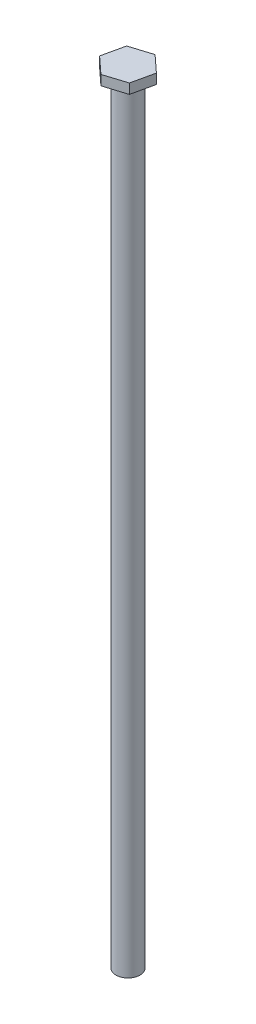
ISO-10303-21;
HEADER;
FILE_DESCRIPTION(('STEP AP214'),'2;1');
FILE_NAME('part.step','',(''),(''),'','','');
FILE_SCHEMA(('AUTOMOTIVE_DESIGN { 1 0 10303 214 1 1 1 1 }'));
ENDSEC;
DATA;
#1=APPLICATION_CONTEXT('core data for automotive mechanical design processes');
#2=APPLICATION_PROTOCOL_DEFINITION('international standard','automotive_design',2000,#1);
#3=PRODUCT_CONTEXT('',#1,'mechanical');
#4=PRODUCT('Part','Part','',(#3));
#5=PRODUCT_RELATED_PRODUCT_CATEGORY('part','',(#4));
#6=PRODUCT_DEFINITION_FORMATION('','',#4);
#7=PRODUCT_DEFINITION_CONTEXT('part definition',#1,'design');
#8=PRODUCT_DEFINITION('design','',#6,#7);
#9=PRODUCT_DEFINITION_SHAPE('','',#8);
#10=(LENGTH_UNIT() NAMED_UNIT(*) SI_UNIT(.MILLI.,.METRE.));
#11=(NAMED_UNIT(*) PLANE_ANGLE_UNIT() SI_UNIT($,.RADIAN.));
#12=(NAMED_UNIT(*) SI_UNIT($,.STERADIAN.) SOLID_ANGLE_UNIT());
#13=UNCERTAINTY_MEASURE_WITH_UNIT(LENGTH_MEASURE(1.E-05),#10,'distance_accuracy_value','');
#14=(GEOMETRIC_REPRESENTATION_CONTEXT(3) GLOBAL_UNCERTAINTY_ASSIGNED_CONTEXT((#13)) GLOBAL_UNIT_ASSIGNED_CONTEXT((#10,
#11,#12)) REPRESENTATION_CONTEXT('',''));
#15=CARTESIAN_POINT('',(0.,0.,0.));
#16=DIRECTION('',(0.,0.,1.));
#17=DIRECTION('',(1.,0.,0.));
#18=AXIS2_PLACEMENT_3D('',#15,#16,#17);
#19=CARTESIAN_POINT('',(0.,-50.,0.));
#20=DIRECTION('',(0.,1.,0.));
#21=DIRECTION('',(0.,0.,1.));
#22=AXIS2_PLACEMENT_3D('',#19,#20,#21);
#23=CYLINDRICAL_SURFACE('',#22,0.611392815707531);
#24=CARTESIAN_POINT('',(0.,-35.,0.));
#25=DIRECTION('',(0.,1.,0.));
#26=DIRECTION('',(0.,0.,1.));
#27=AXIS2_PLACEMENT_3D('',#24,#25,#26);
#28=CIRCLE('',#27,0.611392815707531);
#29=CARTESIAN_POINT('',(0.,-35.,0.611392815707531));
#30=VERTEX_POINT('',#29);
#31=EDGE_CURVE('E36',#30,#30,#28,.F.);
#32=ORIENTED_EDGE('',*,*,#31,.F.);
#33=EDGE_LOOP('',(#32));
#34=FACE_BOUND('',#33,.T.);
#35=CARTESIAN_POINT('',(0.,4.,0.));
#36=DIRECTION('',(0.,1.,0.));
#37=DIRECTION('',(0.,0.,1.));
#38=AXIS2_PLACEMENT_3D('',#35,#36,#37);
#39=CIRCLE('',#38,0.611392815707531);
#40=CARTESIAN_POINT('',(0.,4.,0.611392815707531));
#41=VERTEX_POINT('',#40);
#42=EDGE_CURVE('E11',#41,#41,#39,.T.);
#43=ORIENTED_EDGE('',*,*,#42,.F.);
#44=EDGE_LOOP('',(#43));
#45=FACE_BOUND('',#44,.T.);
#46=ADVANCED_FACE('F33',(#34,#45),#23,.T.);
#47=CARTESIAN_POINT('',(-0.249205436767229,4.5,1.11667333101922));
#48=DIRECTION('',(-0.299366858330706,0.,-0.954138084416089));
#49=DIRECTION('',(-0.954138084416089,0.,0.299366858330706));
#50=AXIS2_PLACEMENT_3D('',#47,#48,#49);
#51=PLANE('',#50);
#52=DIRECTION('',(0.954138084416089,0.,-0.299366858330706));
#53=VECTOR('',#52,1.);
#54=CARTESIAN_POINT('',(-0.249205436767229,4.,1.11667333101922));
#55=LINE('',#54,#53);
#56=CARTESIAN_POINT('',(-0.249205436767229,4.,1.11667333101922));
#57=VERTEX_POINT('',#56);
#58=CARTESIAN_POINT('',(0.842464754007616,4.,0.774154904511225));
#59=VERTEX_POINT('',#58);
#60=EDGE_CURVE('E119',#57,#59,#55,.T.);
#61=ORIENTED_EDGE('',*,*,#60,.T.);
#62=DIRECTION('',(0.,-1.,0.));
#63=VECTOR('',#62,1.);
#64=CARTESIAN_POINT('',(0.842464754007616,4.5,0.774154904511225));
#65=LINE('',#64,#63);
#66=CARTESIAN_POINT('',(0.842464754007616,4.5,0.774154904511225));
#67=VERTEX_POINT('',#66);
#68=EDGE_CURVE('E42',#67,#59,#65,.T.);
#69=ORIENTED_EDGE('',*,*,#68,.F.);
#70=DIRECTION('',(0.954138084416089,0.,-0.299366858330706));
#71=VECTOR('',#70,1.);
#72=CARTESIAN_POINT('',(-0.249205436767229,4.5,1.11667333101922));
#73=LINE('',#72,#71);
#74=CARTESIAN_POINT('',(-0.249205436767229,4.5,1.11667333101922));
#75=VERTEX_POINT('',#74);
#76=EDGE_CURVE('E129',#75,#67,#73,.T.);
#77=ORIENTED_EDGE('',*,*,#76,.F.);
#78=DIRECTION('',(0.,-1.,0.));
#79=VECTOR('',#78,1.);
#80=CARTESIAN_POINT('',(-0.249205436767229,4.5,1.11667333101922));
#81=LINE('',#80,#79);
#82=EDGE_CURVE('E115',#75,#57,#81,.T.);
#83=ORIENTED_EDGE('',*,*,#82,.T.);
#84=EDGE_LOOP('',(#61,#69,#77,#83));
#85=FACE_BOUND('',#84,.T.);
#86=ADVANCED_FACE('F141',(#85),#51,.F.);
#87=CARTESIAN_POINT('',(0.842464754007616,4.5,0.774154904511225));
#88=DIRECTION('',(-0.975991248987907,0.,-0.217809737842516));
#89=DIRECTION('',(-0.217809737842516,0.,0.975991248987907));
#90=AXIS2_PLACEMENT_3D('',#87,#88,#89);
#91=PLANE('',#90);
#92=DIRECTION('',(0.217809737842516,0.,-0.975991248987907));
#93=VECTOR('',#92,1.);
#94=CARTESIAN_POINT('',(0.842464754007616,4.,0.774154904511225));
#95=LINE('',#94,#93);
#96=CARTESIAN_POINT('',(1.09167019077484,4.,-0.342518426507991));
#97=VERTEX_POINT('',#96);
#98=EDGE_CURVE('E122',#59,#97,#95,.T.);
#99=ORIENTED_EDGE('',*,*,#98,.T.);
#100=DIRECTION('',(0.,-1.,0.));
#101=VECTOR('',#100,1.);
#102=CARTESIAN_POINT('',(1.09167019077484,4.5,-0.342518426507991));
#103=LINE('',#102,#101);
#104=CARTESIAN_POINT('',(1.09167019077484,4.5,-0.342518426507991));
#105=VERTEX_POINT('',#104);
#106=EDGE_CURVE('E133',#105,#97,#103,.T.);
#107=ORIENTED_EDGE('',*,*,#106,.F.);
#108=DIRECTION('',(0.217809737842516,0.,-0.975991248987907));
#109=VECTOR('',#108,1.);
#110=CARTESIAN_POINT('',(0.842464754007616,4.5,0.774154904511225));
#111=LINE('',#110,#109);
#112=EDGE_CURVE('E88',#67,#105,#111,.T.);
#113=ORIENTED_EDGE('',*,*,#112,.F.);
#114=ORIENTED_EDGE('',*,*,#68,.T.);
#115=EDGE_LOOP('',(#99,#107,#113,#114));
#116=FACE_BOUND('',#115,.T.);
#117=ADVANCED_FACE('F137',(#116),#91,.F.);
#118=CARTESIAN_POINT('',(1.09167019077484,4.5,-0.342518426507991));
#119=DIRECTION('',(-0.676624390657201,0.,0.736328346573573));
#120=DIRECTION('',(0.736328346573573,0.,0.676624390657201));
#121=AXIS2_PLACEMENT_3D('',#118,#119,#120);
#122=PLANE('',#121);
#123=DIRECTION('',(-0.736328346573573,0.,-0.676624390657201));
#124=VECTOR('',#123,1.);
#125=CARTESIAN_POINT('',(1.09167019077484,4.,-0.342518426507991));
#126=LINE('',#125,#124);
#127=CARTESIAN_POINT('',(0.249205436767229,4.,-1.11667333101922));
#128=VERTEX_POINT('',#127);
#129=EDGE_CURVE('E124',#97,#128,#126,.T.);
#130=ORIENTED_EDGE('',*,*,#129,.T.);
#131=DIRECTION('',(0.,-1.,0.));
#132=VECTOR('',#131,1.);
#133=CARTESIAN_POINT('',(0.249205436767229,4.5,-1.11667333101922));
#134=LINE('',#133,#132);
#135=CARTESIAN_POINT('',(0.249205436767229,4.5,-1.11667333101922));
#136=VERTEX_POINT('',#135);
#137=EDGE_CURVE('E110',#136,#128,#134,.T.);
#138=ORIENTED_EDGE('',*,*,#137,.F.);
#139=DIRECTION('',(-0.736328346573573,0.,-0.676624390657201));
#140=VECTOR('',#139,1.);
#141=CARTESIAN_POINT('',(1.09167019077484,4.5,-0.342518426507991));
#142=LINE('',#141,#140);
#143=EDGE_CURVE('E101',#105,#136,#142,.T.);
#144=ORIENTED_EDGE('',*,*,#143,.F.);
#145=ORIENTED_EDGE('',*,*,#106,.T.);
#146=EDGE_LOOP('',(#130,#138,#144,#145));
#147=FACE_BOUND('',#146,.T.);
#148=ADVANCED_FACE('F146',(#147),#122,.F.);
#149=CARTESIAN_POINT('',(0.249205436767229,4.5,-1.11667333101922));
#150=DIRECTION('',(0.299366858330706,0.,0.954138084416089));
#151=DIRECTION('',(0.954138084416089,0.,-0.299366858330706));
#152=AXIS2_PLACEMENT_3D('',#149,#150,#151);
#153=PLANE('',#152);
#154=DIRECTION('',(-0.954138084416089,0.,0.299366858330706));
#155=VECTOR('',#154,1.);
#156=CARTESIAN_POINT('',(0.249205436767229,4.,-1.11667333101922));
#157=LINE('',#156,#155);
#158=CARTESIAN_POINT('',(-0.842464754007617,4.,-0.774154904511224));
#159=VERTEX_POINT('',#158);
#160=EDGE_CURVE('E109',#128,#159,#157,.T.);
#161=ORIENTED_EDGE('',*,*,#160,.T.);
#162=DIRECTION('',(0.,-1.,0.));
#163=VECTOR('',#162,1.);
#164=CARTESIAN_POINT('',(-0.842464754007617,4.5,-0.774154904511224));
#165=LINE('',#164,#163);
#166=CARTESIAN_POINT('',(-0.842464754007617,4.5,-0.774154904511224));
#167=VERTEX_POINT('',#166);
#168=EDGE_CURVE('E106',#167,#159,#165,.T.);
#169=ORIENTED_EDGE('',*,*,#168,.F.);
#170=DIRECTION('',(-0.954138084416089,0.,0.299366858330706));
#171=VECTOR('',#170,1.);
#172=CARTESIAN_POINT('',(0.249205436767229,4.5,-1.11667333101922));
#173=LINE('',#172,#171);
#174=EDGE_CURVE('E95',#136,#167,#173,.T.);
#175=ORIENTED_EDGE('',*,*,#174,.F.);
#176=ORIENTED_EDGE('',*,*,#137,.T.);
#177=EDGE_LOOP('',(#161,#169,#175,#176));
#178=FACE_BOUND('',#177,.T.);
#179=ADVANCED_FACE('F107',(#178),#153,.F.);
#180=CARTESIAN_POINT('',(-0.842464754007617,4.5,-0.774154904511224));
#181=DIRECTION('',(0.975991248987907,0.,0.217809737842516));
#182=DIRECTION('',(0.217809737842516,0.,-0.975991248987907));
#183=AXIS2_PLACEMENT_3D('',#180,#181,#182);
#184=PLANE('',#183);
#185=DIRECTION('',(-0.217809737842516,0.,0.975991248987907));
#186=VECTOR('',#185,1.);
#187=CARTESIAN_POINT('',(-0.842464754007617,4.,-0.774154904511224));
#188=LINE('',#187,#186);
#189=CARTESIAN_POINT('',(-1.09167019077485,4.,0.342518426507991));
#190=VERTEX_POINT('',#189);
#191=EDGE_CURVE('E73',#159,#190,#188,.T.);
#192=ORIENTED_EDGE('',*,*,#191,.T.);
#193=DIRECTION('',(0.,-1.,0.));
#194=VECTOR('',#193,1.);
#195=CARTESIAN_POINT('',(-1.09167019077485,4.5,0.342518426507991));
#196=LINE('',#195,#194);
#197=CARTESIAN_POINT('',(-1.09167019077485,4.5,0.342518426507991));
#198=VERTEX_POINT('',#197);
#199=EDGE_CURVE('E111',#198,#190,#196,.T.);
#200=ORIENTED_EDGE('',*,*,#199,.F.);
#201=DIRECTION('',(-0.217809737842516,0.,0.975991248987907));
#202=VECTOR('',#201,1.);
#203=CARTESIAN_POINT('',(-0.842464754007617,4.5,-0.774154904511224));
#204=LINE('',#203,#202);
#205=EDGE_CURVE('E99',#167,#198,#204,.T.);
#206=ORIENTED_EDGE('',*,*,#205,.F.);
#207=ORIENTED_EDGE('',*,*,#168,.T.);
#208=EDGE_LOOP('',(#192,#200,#206,#207));
#209=FACE_BOUND('',#208,.T.);
#210=ADVANCED_FACE('F113',(#209),#184,.F.);
#211=CARTESIAN_POINT('',(-1.09167019077485,4.5,0.342518426507991));
#212=DIRECTION('',(0.676624390657201,0.,-0.736328346573572));
#213=DIRECTION('',(-0.736328346573572,0.,-0.676624390657201));
#214=AXIS2_PLACEMENT_3D('',#211,#212,#213);
#215=PLANE('',#214);
#216=DIRECTION('',(0.736328346573572,0.,0.676624390657201));
#217=VECTOR('',#216,1.);
#218=CARTESIAN_POINT('',(-1.09167019077485,4.,0.342518426507991));
#219=LINE('',#218,#217);
#220=EDGE_CURVE('E79',#190,#57,#219,.T.);
#221=ORIENTED_EDGE('',*,*,#220,.T.);
#222=ORIENTED_EDGE('',*,*,#82,.F.);
#223=DIRECTION('',(0.736328346573572,0.,0.676624390657201));
#224=VECTOR('',#223,1.);
#225=CARTESIAN_POINT('',(-1.09167019077485,4.5,0.342518426507991));
#226=LINE('',#225,#224);
#227=EDGE_CURVE('E50',#198,#75,#226,.T.);
#228=ORIENTED_EDGE('',*,*,#227,.F.);
#229=ORIENTED_EDGE('',*,*,#199,.T.);
#230=EDGE_LOOP('',(#221,#222,#228,#229));
#231=FACE_BOUND('',#230,.T.);
#232=ADVANCED_FACE('F176',(#231),#215,.F.);
#233=CARTESIAN_POINT('',(0.,4.5,0.));
#234=DIRECTION('',(0.,1.,0.));
#235=DIRECTION('',(0.,0.,1.));
#236=AXIS2_PLACEMENT_3D('',#233,#234,#235);
#237=PLANE('',#236);
#238=ORIENTED_EDGE('',*,*,#76,.T.);
#239=ORIENTED_EDGE('',*,*,#112,.T.);
#240=ORIENTED_EDGE('',*,*,#143,.T.);
#241=ORIENTED_EDGE('',*,*,#174,.T.);
#242=ORIENTED_EDGE('',*,*,#205,.T.);
#243=ORIENTED_EDGE('',*,*,#227,.T.);
#244=EDGE_LOOP('',(#238,#239,#240,#241,#242,#243));
#245=FACE_BOUND('',#244,.T.);
#246=ADVANCED_FACE('F97',(#245),#237,.T.);
#247=CARTESIAN_POINT('',(0.,4.,0.));
#248=DIRECTION('',(0.,1.,0.));
#249=DIRECTION('',(0.,0.,1.));
#250=AXIS2_PLACEMENT_3D('',#247,#248,#249);
#251=PLANE('',#250);
#252=ORIENTED_EDGE('',*,*,#42,.T.);
#253=EDGE_LOOP('',(#252));
#254=FACE_BOUND('',#253,.T.);
#255=ORIENTED_EDGE('',*,*,#60,.F.);
#256=ORIENTED_EDGE('',*,*,#220,.F.);
#257=ORIENTED_EDGE('',*,*,#191,.F.);
#258=ORIENTED_EDGE('',*,*,#160,.F.);
#259=ORIENTED_EDGE('',*,*,#129,.F.);
#260=ORIENTED_EDGE('',*,*,#98,.F.);
#261=EDGE_LOOP('',(#255,#256,#257,#258,#259,#260));
#262=FACE_BOUND('',#261,.T.);
#263=ADVANCED_FACE('F143',(#254,#262),#251,.F.);
#264=CARTESIAN_POINT('',(0.,-35.,0.));
#265=DIRECTION('',(0.,1.,0.));
#266=DIRECTION('',(0.,0.,1.));
#267=AXIS2_PLACEMENT_3D('',#264,#265,#266);
#268=PLANE('',#267);
#269=ORIENTED_EDGE('',*,*,#31,.T.);
#270=EDGE_LOOP('',(#269));
#271=FACE_BOUND('',#270,.T.);
#272=ADVANCED_FACE('F168',(#271),#268,.F.);
#273=CLOSED_SHELL('',(#46,#86,#117,#148,#179,#210,#232,#246,#263,#272));
#274=MANIFOLD_SOLID_BREP('B2',#273);
#275=ADVANCED_BREP_SHAPE_REPRESENTATION('',(#18,#274),#14);
#276=SHAPE_DEFINITION_REPRESENTATION(#9,#275);
ENDSEC;
END-ISO-10303-21;
